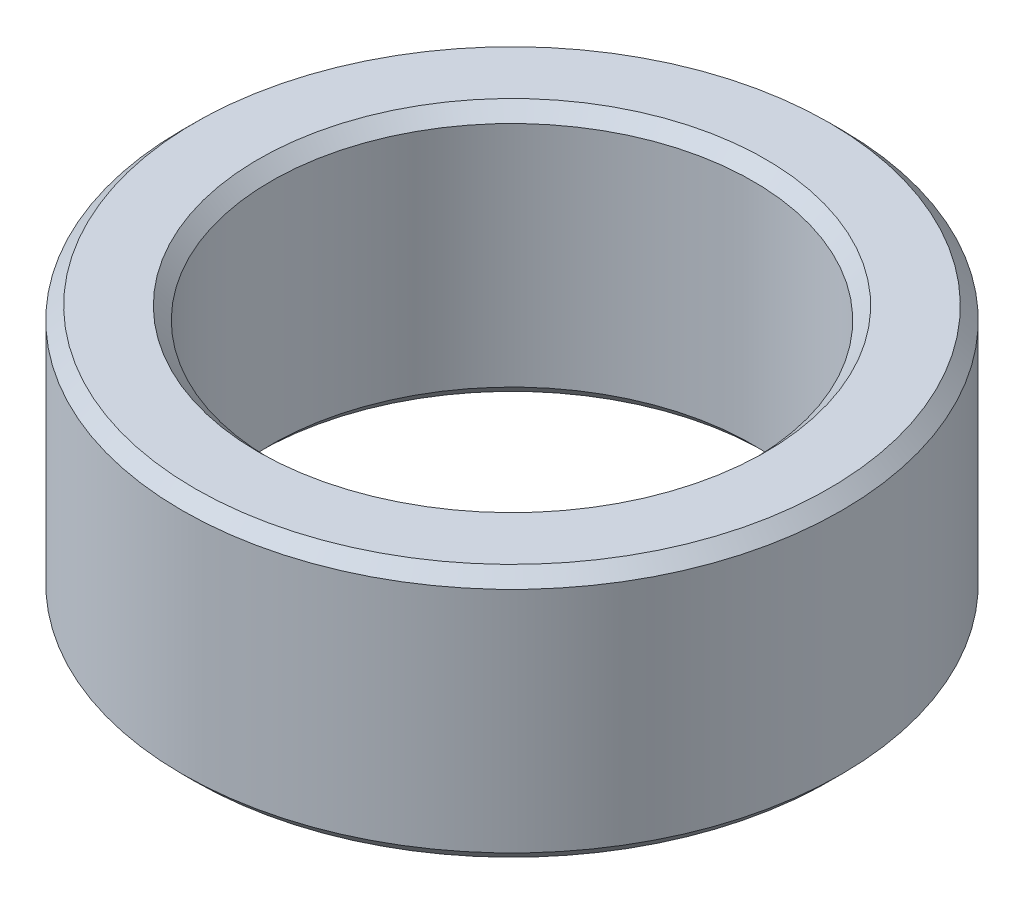
ISO-10303-21;
HEADER;
FILE_DESCRIPTION(('STEP AP214'),'2;1');
FILE_NAME('part.step','',(''),(''),'','','');
FILE_SCHEMA(('AUTOMOTIVE_DESIGN { 1 0 10303 214 1 1 1 1 }'));
ENDSEC;
DATA;
#1=APPLICATION_CONTEXT('core data for automotive mechanical design processes');
#2=APPLICATION_PROTOCOL_DEFINITION('international standard','automotive_design',2000,#1);
#3=PRODUCT_CONTEXT('',#1,'mechanical');
#4=PRODUCT('Part','Part','',(#3));
#5=PRODUCT_RELATED_PRODUCT_CATEGORY('part','',(#4));
#6=PRODUCT_DEFINITION_FORMATION('','',#4);
#7=PRODUCT_DEFINITION_CONTEXT('part definition',#1,'design');
#8=PRODUCT_DEFINITION('design','',#6,#7);
#9=PRODUCT_DEFINITION_SHAPE('','',#8);
#10=(LENGTH_UNIT() NAMED_UNIT(*) SI_UNIT(.MILLI.,.METRE.));
#11=(NAMED_UNIT(*) PLANE_ANGLE_UNIT() SI_UNIT($,.RADIAN.));
#12=(NAMED_UNIT(*) SI_UNIT($,.STERADIAN.) SOLID_ANGLE_UNIT());
#13=UNCERTAINTY_MEASURE_WITH_UNIT(LENGTH_MEASURE(1.E-05),#10,'distance_accuracy_value','');
#14=(GEOMETRIC_REPRESENTATION_CONTEXT(3) GLOBAL_UNCERTAINTY_ASSIGNED_CONTEXT((#13)) GLOBAL_UNIT_ASSIGNED_CONTEXT((#10,
#11,#12)) REPRESENTATION_CONTEXT('',''));
#15=CARTESIAN_POINT('',(0.,0.,0.));
#16=DIRECTION('',(0.,0.,1.));
#17=DIRECTION('',(1.,0.,0.));
#18=AXIS2_PLACEMENT_3D('',#15,#16,#17);
#19=CARTESIAN_POINT('',(0.,5.,0.));
#20=DIRECTION('',(0.,1.,0.));
#21=DIRECTION('',(0.,0.,1.));
#22=AXIS2_PLACEMENT_3D('',#19,#20,#21);
#23=PLANE('',#22);
#24=CARTESIAN_POINT('',(0.,5.,0.));
#25=DIRECTION('',(0.,1.,0.));
#26=DIRECTION('',(0.,0.,1.));
#27=AXIS2_PLACEMENT_3D('',#24,#25,#26);
#28=CIRCLE('',#27,5.);
#29=CARTESIAN_POINT('',(0.,5.,5.));
#30=VERTEX_POINT('',#29);
#31=EDGE_CURVE('E10',#30,#30,#28,.F.);
#32=ORIENTED_EDGE('',*,*,#31,.T.);
#33=EDGE_LOOP('',(#32));
#34=FACE_BOUND('',#33,.T.);
#35=CARTESIAN_POINT('',(0.,5.,0.));
#36=DIRECTION('',(0.,1.,0.));
#37=DIRECTION('',(0.,0.,1.));
#38=AXIS2_PLACEMENT_3D('',#35,#36,#37);
#39=CIRCLE('',#38,6.24999999999999);
#40=CARTESIAN_POINT('',(0.,5.,6.24999999999999));
#41=VERTEX_POINT('',#40);
#42=EDGE_CURVE('E41',#41,#41,#39,.T.);
#43=ORIENTED_EDGE('',*,*,#42,.T.);
#44=EDGE_LOOP('',(#43));
#45=FACE_BOUND('',#44,.T.);
#46=ADVANCED_FACE('F33',(#34,#45),#23,.T.);
#47=CARTESIAN_POINT('',(0.,0.,0.));
#48=DIRECTION('',(0.,1.,0.));
#49=DIRECTION('',(0.,0.,1.));
#50=AXIS2_PLACEMENT_3D('',#47,#48,#49);
#51=PLANE('',#50);
#52=CARTESIAN_POINT('',(0.,0.,0.));
#53=DIRECTION('',(0.,1.,0.));
#54=DIRECTION('',(0.,0.,1.));
#55=AXIS2_PLACEMENT_3D('',#52,#53,#54);
#56=CIRCLE('',#55,5.);
#57=CARTESIAN_POINT('',(0.,0.,5.));
#58=VERTEX_POINT('',#57);
#59=EDGE_CURVE('E60',#58,#58,#56,.T.);
#60=ORIENTED_EDGE('',*,*,#59,.T.);
#61=EDGE_LOOP('',(#60));
#62=FACE_BOUND('',#61,.T.);
#63=CARTESIAN_POINT('',(0.,0.,0.));
#64=DIRECTION('',(0.,1.,0.));
#65=DIRECTION('',(0.,0.,1.));
#66=AXIS2_PLACEMENT_3D('',#63,#64,#65);
#67=CIRCLE('',#66,6.25);
#68=CARTESIAN_POINT('',(0.,0.,6.25));
#69=VERTEX_POINT('',#68);
#70=EDGE_CURVE('E63',#69,#69,#67,.F.);
#71=ORIENTED_EDGE('',*,*,#70,.T.);
#72=EDGE_LOOP('',(#71));
#73=FACE_BOUND('',#72,.T.);
#74=ADVANCED_FACE('F67',(#62,#73),#51,.F.);
#75=CARTESIAN_POINT('',(0.,5.,0.));
#76=DIRECTION('',(0.,-1.,0.));
#77=DIRECTION('',(0.,0.,-1.));
#78=AXIS2_PLACEMENT_3D('',#75,#76,#77);
#79=CYLINDRICAL_SURFACE('',#78,6.5);
#80=CARTESIAN_POINT('',(0.,0.250000000000002,0.));
#81=DIRECTION('',(0.,1.,0.));
#82=DIRECTION('',(0.,0.,1.));
#83=AXIS2_PLACEMENT_3D('',#80,#81,#82);
#84=CIRCLE('',#83,6.5);
#85=CARTESIAN_POINT('',(0.,0.250000000000002,6.5));
#86=VERTEX_POINT('',#85);
#87=EDGE_CURVE('E45',#86,#86,#84,.T.);
#88=ORIENTED_EDGE('',*,*,#87,.T.);
#89=EDGE_LOOP('',(#88));
#90=FACE_BOUND('',#89,.T.);
#91=CARTESIAN_POINT('',(0.,4.74999999999999,0.));
#92=DIRECTION('',(0.,1.,0.));
#93=DIRECTION('',(0.,0.,1.));
#94=AXIS2_PLACEMENT_3D('',#91,#92,#93);
#95=CIRCLE('',#94,6.5);
#96=CARTESIAN_POINT('',(0.,4.74999999999999,6.5));
#97=VERTEX_POINT('',#96);
#98=EDGE_CURVE('E49',#97,#97,#95,.F.);
#99=ORIENTED_EDGE('',*,*,#98,.T.);
#100=EDGE_LOOP('',(#99));
#101=FACE_BOUND('',#100,.T.);
#102=ADVANCED_FACE('F77',(#90,#101),#79,.T.);
#103=CARTESIAN_POINT('',(0.,5.,0.));
#104=DIRECTION('',(0.,-1.,0.));
#105=DIRECTION('',(0.,0.,-1.));
#106=AXIS2_PLACEMENT_3D('',#103,#104,#105);
#107=CYLINDRICAL_SURFACE('',#106,4.75);
#108=CARTESIAN_POINT('',(0.,0.25,0.));
#109=DIRECTION('',(0.,1.,0.));
#110=DIRECTION('',(0.,0.,1.));
#111=AXIS2_PLACEMENT_3D('',#108,#109,#110);
#112=CIRCLE('',#111,4.75);
#113=CARTESIAN_POINT('',(0.,0.25,4.75));
#114=VERTEX_POINT('',#113);
#115=EDGE_CURVE('E54',#114,#114,#112,.F.);
#116=ORIENTED_EDGE('',*,*,#115,.T.);
#117=EDGE_LOOP('',(#116));
#118=FACE_BOUND('',#117,.T.);
#119=CARTESIAN_POINT('',(0.,4.75,0.));
#120=DIRECTION('',(0.,1.,0.));
#121=DIRECTION('',(0.,0.,1.));
#122=AXIS2_PLACEMENT_3D('',#119,#120,#121);
#123=CIRCLE('',#122,4.75);
#124=CARTESIAN_POINT('',(0.,4.75,4.75));
#125=VERTEX_POINT('',#124);
#126=EDGE_CURVE('E57',#125,#125,#123,.T.);
#127=ORIENTED_EDGE('',*,*,#126,.T.);
#128=EDGE_LOOP('',(#127));
#129=FACE_BOUND('',#128,.T.);
#130=ADVANCED_FACE('F80',(#118,#129),#107,.F.);
#131=CARTESIAN_POINT('',(0.,0.,0.));
#132=DIRECTION('',(0.,-1.,0.));
#133=DIRECTION('',(0.,0.,-1.));
#134=AXIS2_PLACEMENT_3D('',#131,#132,#133);
#135=CONICAL_SURFACE('',#134,5.,0.785398163397443);
#136=ORIENTED_EDGE('',*,*,#115,.F.);
#137=EDGE_LOOP('',(#136));
#138=FACE_BOUND('',#137,.T.);
#139=ORIENTED_EDGE('',*,*,#59,.F.);
#140=EDGE_LOOP('',(#139));
#141=FACE_BOUND('',#140,.T.);
#142=ADVANCED_FACE('F73',(#138,#141),#135,.F.);
#143=CARTESIAN_POINT('',(0.,0.250000000000002,0.));
#144=DIRECTION('',(0.,1.,0.));
#145=DIRECTION('',(0.,0.,1.));
#146=AXIS2_PLACEMENT_3D('',#143,#144,#145);
#147=CONICAL_SURFACE('',#146,6.5,0.78539816339745);
#148=ORIENTED_EDGE('',*,*,#70,.F.);
#149=EDGE_LOOP('',(#148));
#150=FACE_BOUND('',#149,.T.);
#151=ORIENTED_EDGE('',*,*,#87,.F.);
#152=EDGE_LOOP('',(#151));
#153=FACE_BOUND('',#152,.T.);
#154=ADVANCED_FACE('F69',(#150,#153),#147,.T.);
#155=CARTESIAN_POINT('',(0.,4.75,0.));
#156=DIRECTION('',(0.,1.,0.));
#157=DIRECTION('',(0.,0.,1.));
#158=AXIS2_PLACEMENT_3D('',#155,#156,#157);
#159=CONICAL_SURFACE('',#158,4.75,0.785398163397453);
#160=ORIENTED_EDGE('',*,*,#31,.F.);
#161=EDGE_LOOP('',(#160));
#162=FACE_BOUND('',#161,.T.);
#163=ORIENTED_EDGE('',*,*,#126,.F.);
#164=EDGE_LOOP('',(#163));
#165=FACE_BOUND('',#164,.T.);
#166=ADVANCED_FACE('F72',(#162,#165),#159,.F.);
#167=CARTESIAN_POINT('',(0.,5.,0.));
#168=DIRECTION('',(0.,-1.,0.));
#169=DIRECTION('',(0.,0.,-1.));
#170=AXIS2_PLACEMENT_3D('',#167,#168,#169);
#171=CONICAL_SURFACE('',#170,6.24999999999999,0.78539816339745);
#172=ORIENTED_EDGE('',*,*,#98,.F.);
#173=EDGE_LOOP('',(#172));
#174=FACE_BOUND('',#173,.T.);
#175=ORIENTED_EDGE('',*,*,#42,.F.);
#176=EDGE_LOOP('',(#175));
#177=FACE_BOUND('',#176,.T.);
#178=ADVANCED_FACE('F36',(#174,#177),#171,.T.);
#179=CLOSED_SHELL('',(#46,#74,#102,#130,#142,#154,#166,#178));
#180=MANIFOLD_SOLID_BREP('B2',#179);
#181=ADVANCED_BREP_SHAPE_REPRESENTATION('',(#18,#180),#14);
#182=SHAPE_DEFINITION_REPRESENTATION(#9,#181);
ENDSEC;
END-ISO-10303-21;
